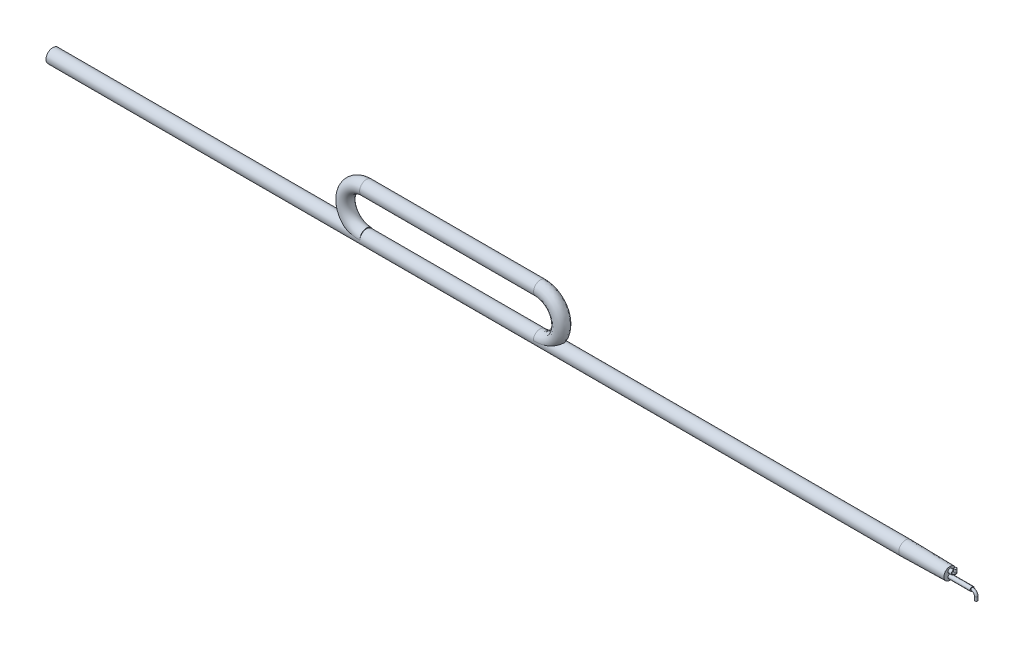
ISO-10303-21;
HEADER;
FILE_DESCRIPTION(('STEP AP214'),'2;1');
FILE_NAME('part.step','',(''),(''),'','','');
FILE_SCHEMA(('AUTOMOTIVE_DESIGN { 1 0 10303 214 1 1 1 1 }'));
ENDSEC;
DATA;
#1=APPLICATION_CONTEXT('core data for automotive mechanical design processes');
#2=APPLICATION_PROTOCOL_DEFINITION('international standard','automotive_design',2000,#1);
#3=PRODUCT_CONTEXT('',#1,'mechanical');
#4=PRODUCT('Part','Part','',(#3));
#5=PRODUCT_RELATED_PRODUCT_CATEGORY('part','',(#4));
#6=PRODUCT_DEFINITION_FORMATION('','',#4);
#7=PRODUCT_DEFINITION_CONTEXT('part definition',#1,'design');
#8=PRODUCT_DEFINITION('design','',#6,#7);
#9=PRODUCT_DEFINITION_SHAPE('','',#8);
#10=(LENGTH_UNIT() NAMED_UNIT(*) SI_UNIT(.MILLI.,.METRE.));
#11=(NAMED_UNIT(*) PLANE_ANGLE_UNIT() SI_UNIT($,.RADIAN.));
#12=(NAMED_UNIT(*) SI_UNIT($,.STERADIAN.) SOLID_ANGLE_UNIT());
#13=UNCERTAINTY_MEASURE_WITH_UNIT(LENGTH_MEASURE(1.E-05),#10,'distance_accuracy_value','');
#14=(GEOMETRIC_REPRESENTATION_CONTEXT(3) GLOBAL_UNCERTAINTY_ASSIGNED_CONTEXT((#13)) GLOBAL_UNIT_ASSIGNED_CONTEXT((#10,
#11,#12)) REPRESENTATION_CONTEXT('',''));
#15=CARTESIAN_POINT('',(0.,0.,0.));
#16=DIRECTION('',(0.,0.,1.));
#17=DIRECTION('',(1.,0.,0.));
#18=AXIS2_PLACEMENT_3D('',#15,#16,#17);
#19=CARTESIAN_POINT('',(178.691973889394,6.508026110606,0.));
#20=DIRECTION('',(0.,1.,0.));
#21=DIRECTION('',(0.,0.,1.));
#22=AXIS2_PLACEMENT_3D('',#19,#20,#21);
#23=CYLINDRICAL_SURFACE('',#22,0.374999999999992);
#24=CARTESIAN_POINT('',(178.691973889394,6.508026110606,0.));
#25=DIRECTION('',(0.,-1.,0.));
#26=DIRECTION('',(0.,0.,-1.));
#27=AXIS2_PLACEMENT_3D('',#24,#25,#26);
#28=CIRCLE('',#27,0.374999999999992);
#29=CARTESIAN_POINT('',(178.691973889394,6.508026110606,-0.375000000000006));
#30=VERTEX_POINT('',#29);
#31=EDGE_CURVE('E12',#30,#30,#28,.T.);
#32=ORIENTED_EDGE('',*,*,#31,.F.);
#33=EDGE_LOOP('',(#32));
#34=FACE_BOUND('',#33,.T.);
#35=CARTESIAN_POINT('',(178.691973889394,7.608026110606,0.));
#36=DIRECTION('',(0.,-1.,0.));
#37=DIRECTION('',(0.,0.,-1.));
#38=AXIS2_PLACEMENT_3D('',#35,#36,#37);
#39=CIRCLE('',#38,0.374999999999992);
#40=CARTESIAN_POINT('',(178.691973889394,7.608026110606,-0.375000000000006));
#41=VERTEX_POINT('',#40);
#42=EDGE_CURVE('E54',#41,#41,#39,.T.);
#43=ORIENTED_EDGE('',*,*,#42,.T.);
#44=EDGE_LOOP('',(#43));
#45=FACE_BOUND('',#44,.T.);
#46=ADVANCED_FACE('F51',(#34,#45),#23,.T.);
#47=CARTESIAN_POINT('',(178.691973889394,6.508026110606,0.));
#48=DIRECTION('',(0.,-1.,0.));
#49=DIRECTION('',(0.,0.,-1.));
#50=AXIS2_PLACEMENT_3D('',#47,#48,#49);
#51=PLANE('',#50);
#52=ORIENTED_EDGE('',*,*,#31,.T.);
#53=EDGE_LOOP('',(#52));
#54=FACE_BOUND('',#53,.T.);
#55=ADVANCED_FACE('F66',(#54),#51,.T.);
#56=CARTESIAN_POINT('',(178.691973889394,7.608026110606,0.));
#57=DIRECTION('',(0.,-1.,0.));
#58=DIRECTION('',(0.,0.,-1.));
#59=AXIS2_PLACEMENT_3D('',#56,#57,#58);
#60=PLANE('',#59);
#61=ORIENTED_EDGE('',*,*,#42,.F.);
#62=EDGE_LOOP('',(#61));
#63=FACE_BOUND('',#62,.T.);
#64=ADVANCED_FACE('F64',(#63),#60,.F.);
#65=CLOSED_SHELL('',(#46,#55,#64));
#66=MANIFOLD_SOLID_BREP('B2',#65);
#67=CARTESIAN_POINT('',(177.5,7.608026110606,0.));
#68=DIRECTION('',(0.,0.,1.));
#69=DIRECTION('',(1.,0.,0.));
#70=AXIS2_PLACEMENT_3D('',#67,#68,#69);
#71=TOROIDAL_SURFACE('',#70,1.19197388939396,0.374999999999992);
#72=CARTESIAN_POINT('',(178.691973889394,7.60802611060601,0.));
#73=DIRECTION('',(0.,-1.,0.));
#74=DIRECTION('',(0.,0.,-1.));
#75=AXIS2_PLACEMENT_3D('',#72,#73,#74);
#76=CIRCLE('',#75,0.374999999999992);
#77=CARTESIAN_POINT('',(179.066973889394,7.60802611060602,0.));
#78=VERTEX_POINT('',#77);
#79=EDGE_CURVE('E50',#78,#78,#76,.T.);
#80=CARTESIAN_POINT('',(177.5,8.8,0.));
#81=DIRECTION('',(1.,0.,0.));
#82=DIRECTION('',(0.,0.,-1.));
#83=AXIS2_PLACEMENT_3D('',#80,#81,#82);
#84=CIRCLE('',#83,0.374999999999992);
#85=CARTESIAN_POINT('',(177.5,9.17499999999995,0.));
#86=VERTEX_POINT('',#85);
#87=EDGE_CURVE('E105',#86,#86,#84,.T.);
#88=CARTESIAN_POINT('',(177.5,7.608026110606,0.));
#89=DIRECTION('',(0.,0.,1.));
#90=DIRECTION('',(1.,0.,0.));
#91=AXIS2_PLACEMENT_3D('',#88,#89,#90);
#92=CIRCLE('',#91,1.56697388939395);
#93=EDGE_CURVE('',#78,#86,#92,.T.);
#94=ORIENTED_EDGE('',*,*,#79,.F.);
#95=ORIENTED_EDGE('',*,*,#87,.T.);
#96=ORIENTED_EDGE('',*,*,#93,.T.);
#97=ORIENTED_EDGE('',*,*,#93,.F.);
#98=EDGE_LOOP('',(#94,#96,#95,#97));
#99=FACE_BOUND('',#98,.T.);
#100=ADVANCED_FACE('F99',(#99),#71,.T.);
#101=CARTESIAN_POINT('',(178.691973889394,7.60802611060601,0.));
#102=DIRECTION('',(0.,-1.,0.));
#103=DIRECTION('',(0.,0.,-1.));
#104=AXIS2_PLACEMENT_3D('',#101,#102,#103);
#105=PLANE('',#104);
#106=ORIENTED_EDGE('',*,*,#79,.T.);
#107=EDGE_LOOP('',(#106));
#108=FACE_BOUND('',#107,.T.);
#109=ADVANCED_FACE('F114',(#108),#105,.T.);
#110=CARTESIAN_POINT('',(177.5,8.8,0.));
#111=DIRECTION('',(1.,0.,0.));
#112=DIRECTION('',(0.,0.,-1.));
#113=AXIS2_PLACEMENT_3D('',#110,#111,#112);
#114=PLANE('',#113);
#115=ORIENTED_EDGE('',*,*,#87,.F.);
#116=EDGE_LOOP('',(#115));
#117=FACE_BOUND('',#116,.T.);
#118=ADVANCED_FACE('F112',(#117),#114,.F.);
#119=CLOSED_SHELL('',(#100,#109,#118));
#120=MANIFOLD_SOLID_BREP('B7',#119);
#121=CARTESIAN_POINT('',(172.6,11.6,0.));
#122=DIRECTION('',(0.,-1.,0.));
#123=DIRECTION('',(1.,0.,0.));
#124=AXIS2_PLACEMENT_3D('',#121,#122,#123);
#125=CYLINDRICAL_SURFACE('',#124,0.374999999999992);
#126=CARTESIAN_POINT('',(172.6,11.6,0.));
#127=DIRECTION('',(0.,1.,0.));
#128=DIRECTION('',(-1.,0.,0.));
#129=AXIS2_PLACEMENT_3D('',#126,#127,#128);
#130=CIRCLE('',#129,0.374999999999992);
#131=CARTESIAN_POINT('',(172.225,11.6,0.));
#132=VERTEX_POINT('',#131);
#133=EDGE_CURVE('E98',#132,#132,#130,.T.);
#134=ORIENTED_EDGE('',*,*,#133,.F.);
#135=EDGE_LOOP('',(#134));
#136=FACE_BOUND('',#135,.T.);
#137=CARTESIAN_POINT('',(172.6,10.8,0.));
#138=DIRECTION('',(0.,1.,0.));
#139=DIRECTION('',(-1.,0.,0.));
#140=AXIS2_PLACEMENT_3D('',#137,#138,#139);
#141=CIRCLE('',#140,0.374999999999992);
#142=CARTESIAN_POINT('',(172.225,10.8,0.));
#143=VERTEX_POINT('',#142);
#144=EDGE_CURVE('E150',#143,#143,#141,.T.);
#145=ORIENTED_EDGE('',*,*,#144,.T.);
#146=EDGE_LOOP('',(#145));
#147=FACE_BOUND('',#146,.T.);
#148=ADVANCED_FACE('F147',(#136,#147),#125,.T.);
#149=CARTESIAN_POINT('',(172.6,11.6,0.));
#150=DIRECTION('',(0.,1.,0.));
#151=DIRECTION('',(-1.,0.,0.));
#152=AXIS2_PLACEMENT_3D('',#149,#150,#151);
#153=PLANE('',#152);
#154=ORIENTED_EDGE('',*,*,#133,.T.);
#155=EDGE_LOOP('',(#154));
#156=FACE_BOUND('',#155,.T.);
#157=ADVANCED_FACE('F162',(#156),#153,.T.);
#158=CARTESIAN_POINT('',(172.6,10.8,0.));
#159=DIRECTION('',(0.,1.,0.));
#160=DIRECTION('',(-1.,0.,0.));
#161=AXIS2_PLACEMENT_3D('',#158,#159,#160);
#162=PLANE('',#161);
#163=ORIENTED_EDGE('',*,*,#144,.F.);
#164=EDGE_LOOP('',(#163));
#165=FACE_BOUND('',#164,.T.);
#166=ADVANCED_FACE('F160',(#165),#162,.F.);
#167=CLOSED_SHELL('',(#148,#157,#166));
#168=MANIFOLD_SOLID_BREP('B45',#167);
#169=CARTESIAN_POINT('',(172.,10.8,0.));
#170=DIRECTION('',(0.,0.,-1.));
#171=DIRECTION('',(-1.,0.,0.));
#172=AXIS2_PLACEMENT_3D('',#169,#170,#171);
#173=TOROIDAL_SURFACE('',#172,0.599999999999989,0.375);
#174=CARTESIAN_POINT('',(172.6,10.8,0.));
#175=DIRECTION('',(0.,1.,0.));
#176=DIRECTION('',(0.,0.,-1.));
#177=AXIS2_PLACEMENT_3D('',#174,#175,#176);
#178=CIRCLE('',#177,0.375);
#179=CARTESIAN_POINT('',(172.975,10.8,0.));
#180=VERTEX_POINT('',#179);
#181=EDGE_CURVE('E146',#180,#180,#178,.T.);
#182=CARTESIAN_POINT('',(172.,10.2,0.));
#183=DIRECTION('',(1.,0.,0.));
#184=DIRECTION('',(0.,0.,-1.));
#185=AXIS2_PLACEMENT_3D('',#182,#183,#184);
#186=CIRCLE('',#185,0.375);
#187=CARTESIAN_POINT('',(172.,9.82500000000001,0.));
#188=VERTEX_POINT('',#187);
#189=EDGE_CURVE('E201',#188,#188,#186,.T.);
#190=CARTESIAN_POINT('',(172.,10.8,0.));
#191=DIRECTION('',(0.,0.,-1.));
#192=DIRECTION('',(-1.,0.,0.));
#193=AXIS2_PLACEMENT_3D('',#190,#191,#192);
#194=CIRCLE('',#193,0.97499999999999);
#195=EDGE_CURVE('',#180,#188,#194,.T.);
#196=ORIENTED_EDGE('',*,*,#181,.F.);
#197=ORIENTED_EDGE('',*,*,#189,.T.);
#198=ORIENTED_EDGE('',*,*,#195,.T.);
#199=ORIENTED_EDGE('',*,*,#195,.F.);
#200=EDGE_LOOP('',(#196,#198,#197,#199));
#201=FACE_BOUND('',#200,.T.);
#202=ADVANCED_FACE('F195',(#201),#173,.T.);
#203=CARTESIAN_POINT('',(172.6,10.8,0.));
#204=DIRECTION('',(0.,1.,0.));
#205=DIRECTION('',(0.,0.,-1.));
#206=AXIS2_PLACEMENT_3D('',#203,#204,#205);
#207=PLANE('',#206);
#208=ORIENTED_EDGE('',*,*,#181,.T.);
#209=EDGE_LOOP('',(#208));
#210=FACE_BOUND('',#209,.T.);
#211=ADVANCED_FACE('F210',(#210),#207,.T.);
#212=CARTESIAN_POINT('',(172.,10.2,0.));
#213=DIRECTION('',(1.,0.,0.));
#214=DIRECTION('',(0.,0.,-1.));
#215=AXIS2_PLACEMENT_3D('',#212,#213,#214);
#216=PLANE('',#215);
#217=ORIENTED_EDGE('',*,*,#189,.F.);
#218=EDGE_LOOP('',(#217));
#219=FACE_BOUND('',#218,.T.);
#220=ADVANCED_FACE('F208',(#219),#216,.F.);
#221=CLOSED_SHELL('',(#202,#211,#220));
#222=MANIFOLD_SOLID_BREP('B93',#221);
#223=CARTESIAN_POINT('',(177.5,8.8,0.));
#224=DIRECTION('',(-1.,0.,0.));
#225=DIRECTION('',(0.,0.,1.));
#226=AXIS2_PLACEMENT_3D('',#223,#224,#225);
#227=CYLINDRICAL_SURFACE('',#226,0.6);
#228=CARTESIAN_POINT('',(177.5,8.8,0.));
#229=DIRECTION('',(1.,0.,0.));
#230=DIRECTION('',(0.,0.,-1.));
#231=AXIS2_PLACEMENT_3D('',#228,#229,#230);
#232=CIRCLE('',#231,0.6);
#233=CARTESIAN_POINT('',(177.5,8.8,-0.600000000000015));
#234=VERTEX_POINT('',#233);
#235=EDGE_CURVE('E194',#234,#234,#232,.T.);
#236=ORIENTED_EDGE('',*,*,#235,.F.);
#237=EDGE_LOOP('',(#236));
#238=FACE_BOUND('',#237,.T.);
#239=CARTESIAN_POINT('',(171.,8.8,0.));
#240=DIRECTION('',(1.,0.,0.));
#241=DIRECTION('',(0.,0.,-1.));
#242=AXIS2_PLACEMENT_3D('',#239,#240,#241);
#243=CIRCLE('',#242,0.6);
#244=CARTESIAN_POINT('',(171.,8.8,-0.600000000000015));
#245=VERTEX_POINT('',#244);
#246=EDGE_CURVE('E246',#245,#245,#243,.T.);
#247=ORIENTED_EDGE('',*,*,#246,.T.);
#248=EDGE_LOOP('',(#247));
#249=FACE_BOUND('',#248,.T.);
#250=ADVANCED_FACE('F243',(#238,#249),#227,.T.);
#251=CARTESIAN_POINT('',(177.5,0.,0.));
#252=DIRECTION('',(1.,0.,0.));
#253=DIRECTION('',(0.,0.,-1.));
#254=AXIS2_PLACEMENT_3D('',#251,#252,#253);
#255=PLANE('',#254);
#256=ORIENTED_EDGE('',*,*,#235,.T.);
#257=EDGE_LOOP('',(#256));
#258=FACE_BOUND('',#257,.T.);
#259=ADVANCED_FACE('F258',(#258),#255,.T.);
#260=CARTESIAN_POINT('',(171.,0.,0.));
#261=DIRECTION('',(1.,0.,0.));
#262=DIRECTION('',(0.,0.,-1.));
#263=AXIS2_PLACEMENT_3D('',#260,#261,#262);
#264=PLANE('',#263);
#265=ORIENTED_EDGE('',*,*,#246,.F.);
#266=EDGE_LOOP('',(#265));
#267=FACE_BOUND('',#266,.T.);
#268=ADVANCED_FACE('F256',(#267),#264,.F.);
#269=CLOSED_SHELL('',(#250,#259,#268));
#270=MANIFOLD_SOLID_BREP('B141',#269);
#271=CARTESIAN_POINT('',(172.,10.2,0.));
#272=DIRECTION('',(-1.,0.,0.));
#273=DIRECTION('',(0.,0.,1.));
#274=AXIS2_PLACEMENT_3D('',#271,#272,#273);
#275=CYLINDRICAL_SURFACE('',#274,0.6);
#276=CARTESIAN_POINT('',(172.,10.2,0.));
#277=DIRECTION('',(1.,0.,0.));
#278=DIRECTION('',(0.,0.,-1.));
#279=AXIS2_PLACEMENT_3D('',#276,#277,#278);
#280=CIRCLE('',#279,0.6);
#281=CARTESIAN_POINT('',(172.,10.2,-0.6));
#282=VERTEX_POINT('',#281);
#283=EDGE_CURVE('E242',#282,#282,#280,.T.);
#284=ORIENTED_EDGE('',*,*,#283,.F.);
#285=EDGE_LOOP('',(#284));
#286=FACE_BOUND('',#285,.T.);
#287=CARTESIAN_POINT('',(171.,10.2,0.));
#288=DIRECTION('',(1.,0.,0.));
#289=DIRECTION('',(0.,0.,-1.));
#290=AXIS2_PLACEMENT_3D('',#287,#288,#289);
#291=CIRCLE('',#290,0.6);
#292=CARTESIAN_POINT('',(171.,10.2,-0.6));
#293=VERTEX_POINT('',#292);
#294=EDGE_CURVE('E295',#293,#293,#291,.T.);
#295=ORIENTED_EDGE('',*,*,#294,.T.);
#296=EDGE_LOOP('',(#295));
#297=FACE_BOUND('',#296,.T.);
#298=ADVANCED_FACE('F292',(#286,#297),#275,.T.);
#299=CARTESIAN_POINT('',(172.,0.,0.));
#300=DIRECTION('',(1.,0.,0.));
#301=DIRECTION('',(0.,0.,-1.));
#302=AXIS2_PLACEMENT_3D('',#299,#300,#301);
#303=PLANE('',#302);
#304=ORIENTED_EDGE('',*,*,#283,.T.);
#305=EDGE_LOOP('',(#304));
#306=FACE_BOUND('',#305,.T.);
#307=ADVANCED_FACE('F307',(#306),#303,.T.);
#308=CARTESIAN_POINT('',(171.,0.,0.));
#309=DIRECTION('',(1.,0.,0.));
#310=DIRECTION('',(0.,0.,-1.));
#311=AXIS2_PLACEMENT_3D('',#308,#309,#310);
#312=PLANE('',#311);
#313=ORIENTED_EDGE('',*,*,#294,.F.);
#314=EDGE_LOOP('',(#313));
#315=FACE_BOUND('',#314,.T.);
#316=ADVANCED_FACE('F305',(#315),#312,.F.);
#317=CLOSED_SHELL('',(#298,#307,#316));
#318=MANIFOLD_SOLID_BREP('B189',#317);
#319=CARTESIAN_POINT('',(-0.0543412460551826,15.8356948487462,0.));
#320=DIRECTION('',(0.,0.,1.));
#321=DIRECTION('',(1.,0.,0.));
#322=AXIS2_PLACEMENT_3D('',#319,#320,#321);
#323=TOROIDAL_SURFACE('',#322,6.16430515125375,2.);
#324=CARTESIAN_POINT('',(-0.0543412460551826,22.,0.));
#325=DIRECTION('',(-1.,0.,0.));
#326=DIRECTION('',(0.,-1.,0.));
#327=AXIS2_PLACEMENT_3D('',#324,#325,#326);
#328=CIRCLE('',#327,2.);
#329=CARTESIAN_POINT('',(-0.0543412460551826,24.,0.));
#330=VERTEX_POINT('',#329);
#331=EDGE_CURVE('E367',#330,#330,#328,.T.);
#332=CARTESIAN_POINT('',(0.,9.67162922395356,0.));
#333=DIRECTION('',(0.999961142990945,0.00881546982537039,0.));
#334=DIRECTION('',(-0.00881546982537039,0.999961142990945,0.));
#335=AXIS2_PLACEMENT_3D('',#332,#333,#334);
#336=CIRCLE('',#335,2.);
#337=CARTESIAN_POINT('',(0.0176309396508251,7.67170693797167,0.));
#338=VERTEX_POINT('',#337);
#339=EDGE_CURVE('E344',#338,#338,#336,.T.);
#340=CARTESIAN_POINT('',(-0.0543412460551826,15.8356948487462,0.));
#341=DIRECTION('',(0.,0.,1.));
#342=DIRECTION('',(1.,0.,0.));
#343=AXIS2_PLACEMENT_3D('',#340,#341,#342);
#344=CIRCLE('',#343,8.16430515125375);
#345=EDGE_CURVE('',#330,#338,#344,.T.);
#346=ORIENTED_EDGE('',*,*,#331,.T.);
#347=ORIENTED_EDGE('',*,*,#339,.F.);
#348=ORIENTED_EDGE('',*,*,#345,.T.);
#349=ORIENTED_EDGE('',*,*,#345,.F.);
#350=EDGE_LOOP('',(#346,#348,#347,#349));
#351=FACE_BOUND('',#350,.T.);
#352=ADVANCED_FACE('F332',(#351),#323,.T.);
#353=CARTESIAN_POINT('',(50.8416306553474,9.5,0.));
#354=DIRECTION('',(-1.,0.,0.));
#355=DIRECTION('',(0.,0.,1.));
#356=AXIS2_PLACEMENT_3D('',#353,#354,#355);
#357=CYLINDRICAL_SURFACE('',#356,2.);
#358=CARTESIAN_POINT('',(50.8416306553474,9.5,0.));
#359=DIRECTION('',(1.,0.,0.));
#360=DIRECTION('',(0.,0.,-1.));
#361=AXIS2_PLACEMENT_3D('',#358,#359,#360);
#362=CIRCLE('',#361,2.);
#363=CARTESIAN_POINT('',(50.8416306553474,9.5,-2.));
#364=VERTEX_POINT('',#363);
#365=CARTESIAN_POINT('',(50.8416306553474,9.50000000000002,2.));
#366=VERTEX_POINT('',#365);
#367=EDGE_CURVE('E350',#364,#366,#362,.T.);
#368=ORIENTED_EDGE('',*,*,#367,.F.);
#369=CARTESIAN_POINT('',(50.8416306553474,9.50000000000002,2.));
#370=CARTESIAN_POINT('',(50.8626764706467,9.50000000825948,2.00000000044204));
#371=CARTESIAN_POINT('',(50.8837222018706,9.50005232330894,2.00000000400459));
#372=CARTESIAN_POINT('',(50.9225670794504,9.50024562533767,1.99999998523166));
#373=CARTESIAN_POINT('',(50.9403662997798,9.50037169092644,1.99999996680595));
#374=CARTESIAN_POINT('',(51.0293633300194,9.50118981686466,1.99999977457273));
#375=CARTESIAN_POINT('',(51.1005567566543,9.50244524563309,1.99999930044522));
#376=CARTESIAN_POINT('',(51.2596576140393,9.50660370301003,1.99999050452446));
#377=CARTESIAN_POINT('',(51.3475569010666,9.50982485628498,1.99998036276797));
#378=CARTESIAN_POINT('',(51.5123170054663,9.51760099906476,1.99992567178634));
#379=CARTESIAN_POINT('',(51.5891882702241,9.52193972557477,1.9998855681882));
#380=CARTESIAN_POINT('',(51.8196733885244,9.53709715617824,1.99968240453078));
#381=CARTESIAN_POINT('',(51.9731526237032,9.55005694174451,1.99943648830985));
#382=CARTESIAN_POINT('',(52.2797580394897,9.58163748155805,1.99839499525117));
#383=CARTESIAN_POINT('',(52.4328833055712,9.60026696938622,1.9975985679858));
#384=CARTESIAN_POINT('',(52.792979802228,9.65064632922907,1.99453176200638));
#385=CARTESIAN_POINT('',(52.9996286102012,9.68470576645007,1.99183620170313));
#386=CARTESIAN_POINT('',(53.4111470470982,9.76247905386712,1.98308841896656));
#387=CARTESIAN_POINT('',(53.6160156345483,9.80619820567159,1.9770343504925));
#388=CARTESIAN_POINT('',(54.0235493861958,9.90313346486231,1.95956933611199));
#389=CARTESIAN_POINT('',(54.2262115498279,9.95636111937909,1.94815184908209));
#390=CARTESIAN_POINT('',(54.6276898206661,10.0715470298678,1.91751819127014));
#391=CARTESIAN_POINT('',(54.8265168984989,10.1334741065359,1.89832942991925));
#392=CARTESIAN_POINT('',(55.2199793834508,10.2653492732942,1.84910877849888));
#393=CARTESIAN_POINT('',(55.4146191009504,10.3352885953125,1.81908866563015));
#394=CARTESIAN_POINT('',(55.7023260740726,10.4451286603418,1.7630667320775));
#395=CARTESIAN_POINT('',(55.7974372567096,10.4825285564388,1.74258378891787));
#396=CARTESIAN_POINT('',(55.9860418113794,10.5587726821453,1.69734197358713));
#397=CARTESIAN_POINT('',(56.0795355384639,10.597616588727,1.67258405327337));
#398=CARTESIAN_POINT('',(56.2490867888097,10.6698897625521,1.62263670263363));
#399=CARTESIAN_POINT('',(56.3254457857647,10.7031383536705,1.59821165248582));
#400=CARTESIAN_POINT('',(56.4765211620943,10.7702629753463,1.54539867099386));
#401=CARTESIAN_POINT('',(56.5512373629883,10.8041390733493,1.51701031149656));
#402=CARTESIAN_POINT('',(56.6985720175586,10.8722268806295,1.45570987041217));
#403=CARTESIAN_POINT('',(56.7711921434981,10.9064382914619,1.42280152280235));
#404=CARTESIAN_POINT('',(56.9138198693132,10.974839478128,1.35176842858207));
#405=CARTESIAN_POINT('',(56.9838280536692,11.0090292570986,1.31364485801348));
#406=CARTESIAN_POINT('',(57.1436788779067,11.0884032809882,1.21741160061834));
#407=CARTESIAN_POINT('',(57.232228797261,11.1333982286185,1.15690173299376));
#408=CARTESIAN_POINT('',(57.3582868373051,11.1986945912172,1.0564174876609));
#409=CARTESIAN_POINT('',(57.3991498021921,11.2200785708158,1.02133326651412));
#410=CARTESIAN_POINT('',(57.4781818930457,11.2618065824454,0.947543517000946));
#411=CARTESIAN_POINT('',(57.5163473095983,11.2821491722566,0.908833166000575));
#412=CARTESIAN_POINT('',(57.6009610455307,11.3276125248541,0.81448687706411));
#413=CARTESIAN_POINT('',(57.6461344847664,11.352170404173,0.757407111419154));
#414=CARTESIAN_POINT('',(57.7282610943462,11.3971941815307,0.636244675173851));
#415=CARTESIAN_POINT('',(57.7652362569914,11.4176710118779,0.572181444860619));
#416=CARTESIAN_POINT('',(57.8219404063203,11.4492584657883,0.451076837389617));
#417=CARTESIAN_POINT('',(57.8436465466671,11.4614265475225,0.395249066864587));
#418=CARTESIAN_POINT('',(57.8786863550242,11.4811269487139,0.280229983136105));
#419=CARTESIAN_POINT('',(57.892027364744,11.4886633330938,0.221041669238267));
#420=CARTESIAN_POINT('',(57.9092378431116,11.4983937410725,0.100479639440275));
#421=CARTESIAN_POINT('',(57.913051322256,11.5005561837638,0.0390951452268223));
#422=CARTESIAN_POINT('',(57.910653408215,11.4991982812538,-0.0834146617949375));
#423=CARTESIAN_POINT('',(57.904441886005,11.4956778629125,-0.144539971257313));
#424=CARTESIAN_POINT('',(57.883589274371,11.4839001415669,-0.259174235309216));
#425=CARTESIAN_POINT('',(57.8697404302607,11.4760882635322,-0.312879298710887));
#426=CARTESIAN_POINT('',(57.8351938835199,11.456689159205,-0.41736843483125));
#427=CARTESIAN_POINT('',(57.814487006424,11.4450968759231,-0.468148487152212));
#428=CARTESIAN_POINT('',(57.7733579997555,11.4222047839744,-0.553683331542066));
#429=CARTESIAN_POINT('',(57.7541921756028,11.4115745863159,-0.589239361453154));
#430=CARTESIAN_POINT('',(57.7131617492494,11.3889265161128,-0.6582346354972));
#431=CARTESIAN_POINT('',(57.6912994629251,11.3769098349244,-0.691675659282319));
#432=CARTESIAN_POINT('',(57.6221440418147,11.3391041873445,-0.789021296824943));
#433=CARTESIAN_POINT('',(57.5713562837223,11.3116010857623,-0.849801445246369));
#434=CARTESIAN_POINT('',(57.4734878607857,11.2592987471689,-0.952646915050242));
#435=CARTESIAN_POINT('',(57.4275347884543,11.2349778936479,-0.99607431069462));
#436=CARTESIAN_POINT('',(57.3322235372816,11.1851122206334,-1.07828911177227));
#437=CARTESIAN_POINT('',(57.2828634354355,11.1595667124429,-1.11707386246396));
#438=CARTESIAN_POINT('',(57.1814211248026,11.1077141730624,-1.19049533980674));
#439=CARTESIAN_POINT('',(57.1293348127674,11.0814060222023,-1.22512553957021));
#440=CARTESIAN_POINT('',(57.023024161077,11.0284124178366,-1.29063066244024));
#441=CARTESIAN_POINT('',(56.9687990267845,11.0017268265078,-1.32150417208516));
#442=CARTESIAN_POINT('',(56.807185608309,10.9232938306181,-1.40716590999183));
#443=CARTESIAN_POINT('',(56.6974272379926,10.8714080753411,-1.45737134965615));
#444=CARTESIAN_POINT('',(56.4733920551304,10.768579145099,-1.54770226943581));
#445=CARTESIAN_POINT('',(56.359110990787,10.7176369265186,-1.58781799049942));
#446=CARTESIAN_POINT('',(56.1270562283368,10.6174212696575,-1.65987399299164));
#447=CARTESIAN_POINT('',(56.0092766687591,10.5681509672112,-1.6917995770506));
#448=CARTESIAN_POINT('',(55.7712223994969,10.4719457756463,-1.74884066610327));
#449=CARTESIAN_POINT('',(55.6509485446395,10.4250101045653,-1.77395846401171));
#450=CARTESIAN_POINT('',(55.3806967043237,10.3234773664128,-1.82366942374262));
#451=CARTESIAN_POINT('',(55.2301980078758,10.2695731397307,-1.8468374761571));
#452=CARTESIAN_POINT('',(54.926709638197,10.1665034627175,-1.88648329638169));
#453=CARTESIAN_POINT('',(54.7737194610512,10.1173389852963,-1.90295969284223));
#454=CARTESIAN_POINT('',(54.4659215303094,10.0242350595108,-1.93068201004688));
#455=CARTESIAN_POINT('',(54.3111164320499,9.98028882371439,-1.94193478193816));
#456=CARTESIAN_POINT('',(53.999861165936,9.89783248372284,-1.96048792324858));
#457=CARTESIAN_POINT('',(53.8434112067594,9.85932169868374,-1.96778878800859));
#458=CARTESIAN_POINT('',(53.499361953684,9.78116258796567,-1.98060687317723));
#459=CARTESIAN_POINT('',(53.3114754450619,9.74268039966061,-1.98552433326028));
#460=CARTESIAN_POINT('',(52.9342072709816,9.67384070386085,-1.99273033070913));
#461=CARTESIAN_POINT('',(52.7448258953925,9.64348165920939,-1.99501936572666));
#462=CARTESIAN_POINT('',(52.4376964245297,9.60126322491367,-1.99749917299219));
#463=CARTESIAN_POINT('',(52.3203081730226,9.58677279205581,-1.99815787499022));
#464=CARTESIAN_POINT('',(52.0851754096679,9.56110455835054,-1.99910772653875));
#465=CARTESIAN_POINT('',(51.9674309216676,9.54992654051133,-1.99939890016962));
#466=CARTESIAN_POINT('',(51.7054465268372,9.52881183141979,-1.9998267103151));
#467=CARTESIAN_POINT('',(51.5611385360449,9.51970425111304,-1.99991456870707));
#468=CARTESIAN_POINT('',(51.3313506236012,9.50920093713299,-1.99998220464631));
#469=CARTESIAN_POINT('',(51.2459411621392,9.50617462265504,-1.99999148480671));
#470=CARTESIAN_POINT('',(51.0752777828055,9.50186496976897,-2.00000043546053));
#471=CARTESIAN_POINT('',(50.9900239727725,9.50057754020889,-2.00000012855111));
#472=CARTESIAN_POINT('',(50.8837220504974,9.50005325265812,-1.99999996057861));
#473=CARTESIAN_POINT('',(50.8626762760405,9.50000228183407,-1.99999993781608));
#474=CARTESIAN_POINT('',(50.8416306553474,9.50000416985201,-1.99999999999131));
#475=B_SPLINE_CURVE_WITH_KNOTS('',3,(#369,#370,#371,#372,#373,#374,#375,#376,#377,#378,#379,
#380,#381,#382,#383,#384,#385,#386,#387,#388,#389,#390,#391,#392,#393,#394,#395,#396,#397,#398,
#399,#400,#401,#402,#403,#404,#405,#406,#407,#408,#409,#410,#411,#412,#413,#414,#415,#416,#417,
#418,#419,#420,#421,#422,#423,#424,#425,#426,#427,#428,#429,#430,#431,#432,#433,#434,#435,#436,
#437,#438,#439,#440,#441,#442,#443,#444,#445,#446,#447,#448,#449,#450,#451,#452,#453,#454,#455,
#456,#457,#458,#459,#460,#461,#462,#463,#464,#465,#466,#467,#468,#469,#470,#471,#472,#473,#474),
.UNSPECIFIED.,.F.,.F.,(4,2,2,2,2,2,2,2,2,2,2,2,2,2,2,2,2,2,2,2,2,2,2,2,2,2,2,2,2,2,2,2,2,2,2,2,
2,2,2,2,2,2,2,2,2,2,2,2,2,2,2,2,4),(0.,0.063137213237827,0.116536107649483,0.330138854318403,
0.59399274841673,0.824963274915193,1.28692215144951,1.74959626006813,2.37769289974915,
3.00613512217645,3.63534577858033,4.26235626025983,4.88868702217587,5.2012990553369,
5.51384157251114,5.77412327641359,6.03443312012977,6.29452920011021,6.55456672435948,
6.90248512072645,7.07617973476074,7.25010872867163,7.47988060860558,7.70902844886771,
7.89167060944509,8.07415224778268,8.25770376201394,8.44125763862342,8.60861365091261,
8.77619445738673,8.90132933957554,9.02635748750486,9.27691669949512,9.47989373818579,
9.68298629362402,9.8863938456962,10.0898776951293,10.4833337181165,10.8771688515772,
11.2717058630567,11.6661098258385,12.1504302783844,12.6348499347635,13.1186324333285,
13.6023542794647,14.1776971727166,14.7529311156985,15.1077312535664,15.4625081438208,
15.8961962917297,16.1525707868234,16.4083410413563,16.4714782443594),.UNSPECIFIED.);
#476=EDGE_CURVE('E290',#364,#366,#475,.F.);
#477=ORIENTED_EDGE('',*,*,#476,.T.);
#478=EDGE_LOOP('',(#368,#477));
#479=FACE_BOUND('',#478,.T.);
#480=CARTESIAN_POINT('',(158.,9.5,0.));
#481=DIRECTION('',(1.,0.,0.));
#482=DIRECTION('',(0.,0.,-1.));
#483=AXIS2_PLACEMENT_3D('',#480,#481,#482);
#484=CIRCLE('',#483,2.);
#485=CARTESIAN_POINT('',(158.,9.5,-2.));
#486=VERTEX_POINT('',#485);
#487=EDGE_CURVE('E363',#486,#486,#484,.T.);
#488=ORIENTED_EDGE('',*,*,#487,.F.);
#489=EDGE_LOOP('',(#488));
#490=FACE_BOUND('',#489,.T.);
#491=CARTESIAN_POINT('',(-92.,9.5,0.));
#492=DIRECTION('',(1.,0.,0.));
#493=DIRECTION('',(0.,0.,-1.));
#494=AXIS2_PLACEMENT_3D('',#491,#492,#493);
#495=CIRCLE('',#494,2.);
#496=CARTESIAN_POINT('',(-92.,9.5,-2.));
#497=VERTEX_POINT('',#496);
#498=EDGE_CURVE('E354',#497,#497,#495,.T.);
#499=ORIENTED_EDGE('',*,*,#498,.T.);
#500=EDGE_LOOP('',(#499));
#501=FACE_BOUND('',#500,.T.);
#502=ADVANCED_FACE('F356',(#479,#490,#501),#357,.T.);
#503=CARTESIAN_POINT('',(-92.,9.5,0.));
#504=DIRECTION('',(1.,0.,0.));
#505=DIRECTION('',(0.,0.,-1.));
#506=AXIS2_PLACEMENT_3D('',#503,#504,#505);
#507=PLANE('',#506);
#508=ORIENTED_EDGE('',*,*,#498,.F.);
#509=EDGE_LOOP('',(#508));
#510=FACE_BOUND('',#509,.T.);
#511=ADVANCED_FACE('F359',(#510),#507,.F.);
#512=CARTESIAN_POINT('',(50.8416306553474,9.5,-2.));
#513=CARTESIAN_POINT('',(51.1188721951863,9.5,-2.));
#514=CARTESIAN_POINT('',(51.7097730245175,9.53865467611853,-2.));
#515=CARTESIAN_POINT('',(52.6355251945935,9.73532777780691,-2.));
#516=CARTESIAN_POINT('',(53.6280606252787,10.1178091101531,-2.));
#517=CARTESIAN_POINT('',(54.5653196534166,10.6888826143969,-2.));
#518=CARTESIAN_POINT('',(55.3954658302602,11.4267308545007,-2.));
#519=CARTESIAN_POINT('',(56.0882700227403,12.2901366928491,-2.));
#520=CARTESIAN_POINT('',(56.6399935790979,13.3188473434443,-2.));
#521=CARTESIAN_POINT('',(56.9975821877915,14.4752279991262,-2.));
#522=CARTESIAN_POINT('',(57.1345655138929,15.7016278982299,-2.));
#523=CARTESIAN_POINT('',(57.0165976778548,16.9300027326156,-2.));
#524=CARTESIAN_POINT('',(56.6769663131797,18.0917842828548,-2.));
#525=CARTESIAN_POINT('',(56.1412454713812,19.1289186341761,-2.));
#526=CARTESIAN_POINT('',(55.46190005871,20.0029535937273,-2.));
#527=CARTESIAN_POINT('',(54.6432840683709,20.753573684508,-2.));
#528=CARTESIAN_POINT('',(53.7149843374241,21.3390984253175,-2.));
#529=CARTESIAN_POINT('',(52.7284936177647,21.7369099206404,-2.));
#530=CARTESIAN_POINT('',(51.8058977115259,21.9479011524593,-2.));
#531=CARTESIAN_POINT('',(51.2156680236016,21.9957050499816,-2.));
#532=CARTESIAN_POINT('',(50.9384597538539,22.,-2.));
#533=CARTESIAN_POINT('',(50.8416306553474,13.5,-2.));
#534=CARTESIAN_POINT('',(51.1188721951863,13.5,-2.));
#535=CARTESIAN_POINT('',(51.0618656659194,13.5135336263562,-2.));
#536=CARTESIAN_POINT('',(51.5170201492858,13.5848725090541,-2.));
#537=CARTESIAN_POINT('',(51.8358041314617,13.7222883848296,-2.));
#538=CARTESIAN_POINT('',(52.1858036134039,13.9293564535332,-2.));
#539=CARTESIAN_POINT('',(52.4759846049959,14.1892139470503,-2.));
#540=CARTESIAN_POINT('',(52.7375131901881,14.5161852917189,-2.));
#541=CARTESIAN_POINT('',(52.9196852985589,14.8540300409676,-2.));
#542=CARTESIAN_POINT('',(53.0601730051299,15.3050766317118,-2.));
#543=CARTESIAN_POINT('',(53.1062907935105,15.7328322402826,-2.));
#544=CARTESIAN_POINT('',(53.0668075543022,16.1612509109997,-2.));
#545=CARTESIAN_POINT('',(52.9333128252148,16.6144199511215,-2.));
#546=CARTESIAN_POINT('',(52.7564371479515,16.9550456854493,-2.));
#547=CARTESIAN_POINT('',(52.4998648135256,17.2860314984472,-2.));
#548=CARTESIAN_POINT('',(52.2142533638304,17.5503453244704,-2.));
#549=CARTESIAN_POINT('',(51.8654462662185,17.7628425198534,-2.));
#550=CARTESIAN_POINT('',(51.5556905881966,17.9050741070932,-2.));
#551=CARTESIAN_POINT('',(51.0802571106032,17.9837877953598,-2.));
#552=CARTESIAN_POINT('',(51.1846827120796,17.9957050499816,-2.));
#553=CARTESIAN_POINT('',(50.9074744423318,18.,-2.));
#554=CARTESIAN_POINT('',(50.8416306553474,13.5,2.));
#555=CARTESIAN_POINT('',(51.1188721951863,13.5,2.));
#556=CARTESIAN_POINT('',(51.0618656659194,13.5135336263562,2.));
#557=CARTESIAN_POINT('',(51.5170201492858,13.5848725090541,2.));
#558=CARTESIAN_POINT('',(51.8358041314617,13.7222883848296,2.));
#559=CARTESIAN_POINT('',(52.1858036134039,13.9293564535332,2.));
#560=CARTESIAN_POINT('',(52.4759846049959,14.1892139470503,2.));
#561=CARTESIAN_POINT('',(52.7375131901881,14.5161852917189,2.));
#562=CARTESIAN_POINT('',(52.9196852985589,14.8540300409676,2.));
#563=CARTESIAN_POINT('',(53.0601730051299,15.3050766317118,2.));
#564=CARTESIAN_POINT('',(53.1062907935105,15.7328322402826,2.));
#565=CARTESIAN_POINT('',(53.0668075543022,16.1612509109997,2.));
#566=CARTESIAN_POINT('',(52.9333128252148,16.6144199511215,2.));
#567=CARTESIAN_POINT('',(52.7564371479515,16.9550456854493,2.));
#568=CARTESIAN_POINT('',(52.4998648135256,17.2860314984472,2.));
#569=CARTESIAN_POINT('',(52.2142533638304,17.5503453244704,2.));
#570=CARTESIAN_POINT('',(51.8654462662185,17.7628425198534,2.));
#571=CARTESIAN_POINT('',(51.5556905881966,17.9050741070932,2.));
#572=CARTESIAN_POINT('',(51.0802571106032,17.9837877953598,2.));
#573=CARTESIAN_POINT('',(51.1846827120796,17.9957050499816,2.));
#574=CARTESIAN_POINT('',(50.9074744423318,18.,2.));
#575=CARTESIAN_POINT('',(50.8416306553474,9.5,2.));
#576=CARTESIAN_POINT('',(51.1188721951863,9.5,2.));
#577=CARTESIAN_POINT('',(51.7097730245175,9.53865467611853,2.));
#578=CARTESIAN_POINT('',(52.6355251945935,9.73532777780691,2.));
#579=CARTESIAN_POINT('',(53.6280606252787,10.1178091101531,2.));
#580=CARTESIAN_POINT('',(54.5653196534166,10.6888826143969,2.));
#581=CARTESIAN_POINT('',(55.3954658302602,11.4267308545007,2.));
#582=CARTESIAN_POINT('',(56.0882700227403,12.2901366928491,2.));
#583=CARTESIAN_POINT('',(56.6399935790979,13.3188473434443,2.));
#584=CARTESIAN_POINT('',(56.9975821877915,14.4752279991262,2.));
#585=CARTESIAN_POINT('',(57.1345655138929,15.7016278982299,2.));
#586=CARTESIAN_POINT('',(57.0165976778548,16.9300027326156,2.));
#587=CARTESIAN_POINT('',(56.6769663131797,18.0917842828548,2.));
#588=CARTESIAN_POINT('',(56.1412454713812,19.1289186341761,2.));
#589=CARTESIAN_POINT('',(55.46190005871,20.0029535937273,2.));
#590=CARTESIAN_POINT('',(54.6432840683709,20.753573684508,2.));
#591=CARTESIAN_POINT('',(53.7149843374241,21.3390984253175,2.));
#592=CARTESIAN_POINT('',(52.7284936177647,21.7369099206404,2.));
#593=CARTESIAN_POINT('',(51.8058977115259,21.9479011524593,2.));
#594=CARTESIAN_POINT('',(51.2156680236016,21.9957050499816,2.));
#595=CARTESIAN_POINT('',(50.9384597538539,22.,2.));
#596=CARTESIAN_POINT('',(50.8416306553474,5.5,2.));
#597=CARTESIAN_POINT('',(51.1188721951863,5.5,2.));
#598=CARTESIAN_POINT('',(52.3576803831156,5.56377572588087,2.));
#599=CARTESIAN_POINT('',(53.7540302399011,5.88578304655971,2.));
#600=CARTESIAN_POINT('',(55.4203171190957,6.51332983547662,2.));
#601=CARTESIAN_POINT('',(56.9448356934292,7.44840877526054,2.));
#602=CARTESIAN_POINT('',(58.3149470555245,8.66424776195117,2.));
#603=CARTESIAN_POINT('',(59.4390268552926,10.0640880939794,2.));
#604=CARTESIAN_POINT('',(60.3603018596369,11.7836646459211,2.));
#605=CARTESIAN_POINT('',(60.9349913704531,13.6453793665406,2.));
#606=CARTESIAN_POINT('',(61.1628402342752,15.6704235561771,2.));
#607=CARTESIAN_POINT('',(60.9663878014073,17.6987545542316,2.));
#608=CARTESIAN_POINT('',(60.4206198011446,19.5691486145882,2.));
#609=CARTESIAN_POINT('',(59.5260537948109,21.3027915829029,2.));
#610=CARTESIAN_POINT('',(58.4239353038946,22.7198756890074,2.));
#611=CARTESIAN_POINT('',(57.0723147729115,23.9568020445457,2.));
#612=CARTESIAN_POINT('',(55.5645224086296,24.9153543307815,2.));
#613=CARTESIAN_POINT('',(53.9012966473329,25.5687457341876,2.));
#614=CARTESIAN_POINT('',(52.5315383124485,25.9120145095588,2.));
#615=CARTESIAN_POINT('',(51.2466533351237,25.9957050499816,2.));
#616=CARTESIAN_POINT('',(50.9694450653759,26.,2.));
#617=CARTESIAN_POINT('',(50.8416306553474,5.5,-2.));
#618=CARTESIAN_POINT('',(51.1188721951863,5.5,-2.));
#619=CARTESIAN_POINT('',(52.3576803831156,5.56377572588087,-2.));
#620=CARTESIAN_POINT('',(53.7540302399011,5.88578304655971,-2.));
#621=CARTESIAN_POINT('',(55.4203171190957,6.51332983547662,-2.));
#622=CARTESIAN_POINT('',(56.9448356934292,7.44840877526054,-2.));
#623=CARTESIAN_POINT('',(58.3149470555245,8.66424776195117,-2.));
#624=CARTESIAN_POINT('',(59.4390268552926,10.0640880939794,-2.));
#625=CARTESIAN_POINT('',(60.3603018596369,11.7836646459211,-2.));
#626=CARTESIAN_POINT('',(60.9349913704531,13.6453793665406,-2.));
#627=CARTESIAN_POINT('',(61.1628402342752,15.6704235561771,-2.));
#628=CARTESIAN_POINT('',(60.9663878014073,17.6987545542316,-2.));
#629=CARTESIAN_POINT('',(60.4206198011446,19.5691486145882,-2.));
#630=CARTESIAN_POINT('',(59.5260537948109,21.3027915829029,-2.));
#631=CARTESIAN_POINT('',(58.4239353038946,22.7198756890074,-2.));
#632=CARTESIAN_POINT('',(57.0723147729115,23.9568020445457,-2.));
#633=CARTESIAN_POINT('',(55.5645224086296,24.9153543307815,-2.));
#634=CARTESIAN_POINT('',(53.9012966473329,25.5687457341876,-2.));
#635=CARTESIAN_POINT('',(52.5315383124485,25.9120145095588,-2.));
#636=CARTESIAN_POINT('',(51.2466533351237,25.9957050499816,-2.));
#637=CARTESIAN_POINT('',(50.9694450653759,26.,-2.));
#638=CARTESIAN_POINT('',(50.8416306553474,9.5,-2.));
#639=CARTESIAN_POINT('',(51.1188721951863,9.5,-2.));
#640=CARTESIAN_POINT('',(51.7097730245175,9.53865467611853,-2.));
#641=CARTESIAN_POINT('',(52.6355251945935,9.73532777780691,-2.));
#642=CARTESIAN_POINT('',(53.6280606252787,10.1178091101531,-2.));
#643=CARTESIAN_POINT('',(54.5653196534166,10.6888826143969,-2.));
#644=CARTESIAN_POINT('',(55.3954658302602,11.4267308545007,-2.));
#645=CARTESIAN_POINT('',(56.0882700227403,12.2901366928491,-2.));
#646=CARTESIAN_POINT('',(56.6399935790979,13.3188473434443,-2.));
#647=CARTESIAN_POINT('',(56.9975821877915,14.4752279991262,-2.));
#648=CARTESIAN_POINT('',(57.1345655138929,15.7016278982299,-2.));
#649=CARTESIAN_POINT('',(57.0165976778548,16.9300027326156,-2.));
#650=CARTESIAN_POINT('',(56.6769663131797,18.0917842828548,-2.));
#651=CARTESIAN_POINT('',(56.1412454713812,19.1289186341761,-2.));
#652=CARTESIAN_POINT('',(55.46190005871,20.0029535937273,-2.));
#653=CARTESIAN_POINT('',(54.6432840683709,20.753573684508,-2.));
#654=CARTESIAN_POINT('',(53.7149843374241,21.3390984253175,-2.));
#655=CARTESIAN_POINT('',(52.7284936177647,21.7369099206404,-2.));
#656=CARTESIAN_POINT('',(51.8058977115259,21.9479011524593,-2.));
#657=CARTESIAN_POINT('',(51.2156680236016,21.9957050499816,-2.));
#658=CARTESIAN_POINT('',(50.9384597538539,22.,-2.));
#659=(BOUNDED_SURFACE() B_SPLINE_SURFACE(3,3,((#512,#513,#514,#515,#516,#517,#518,#519,#520,
#521,#522,#523,#524,#525,#526,#527,#528,#529,#530,#531,#532),(#533,#534,#535,#536,#537,#538,
#539,#540,#541,#542,#543,#544,#545,#546,#547,#548,#549,#550,#551,#552,#553),(#554,#555,#556,
#557,#558,#559,#560,#561,#562,#563,#564,#565,#566,#567,#568,#569,#570,#571,#572,#573,#574),
(#575,#576,#577,#578,#579,#580,#581,#582,#583,#584,#585,#586,#587,#588,#589,#590,#591,#592,#593,
#594,#595),(#596,#597,#598,#599,#600,#601,#602,#603,#604,#605,#606,#607,#608,#609,#610,#611,
#612,#613,#614,#615,#616),(#617,#618,#619,#620,#621,#622,#623,#624,#625,#626,#627,#628,#629,
#630,#631,#632,#633,#634,#635,#636,#637),(#638,#639,#640,#641,#642,#643,#644,#645,#646,#647,
#648,#649,#650,#651,#652,#653,#654,#655,#656,#657,#658)),.UNSPECIFIED.,.T.,.F.,
.F.) B_SPLINE_SURFACE_WITH_KNOTS((4,3,4),(4,1,1,1,1,1,1,1,1,1,1,1,1,1,1,1,1,1,4),(0.,0.5,1.),
(0.,0.0426260375283533,0.0907327044166282,0.144975277982239,0.205405545680428,0.258416618388931,
0.314998878878476,0.374732269100834,0.436799523032778,0.499999946769323,0.563200370505867,
0.625267624437811,0.685001014660171,0.741583275149715,0.79459434785822,0.85502461555641,
0.90926718912202,0.957373856010296,1.),
.UNSPECIFIED.) GEOMETRIC_REPRESENTATION_ITEM() RATIONAL_B_SPLINE_SURFACE(((1.,1.,1.,1.,1.,1.,1.,
1.,1.,1.,1.,1.,1.,1.,1.,1.,1.,1.,1.,1.,1.),(0.333333333333333,0.333333333333333,
0.333333333333333,0.333333333333333,0.333333333333333,0.333333333333333,0.333333333333333,
0.333333333333333,0.333333333333333,0.333333333333333,0.333333333333333,0.333333333333333,
0.333333333333333,0.333333333333333,0.333333333333333,0.333333333333333,0.333333333333333,
0.333333333333333,0.333333333333333,0.333333333333333,0.333333333333333),(0.333333333333333,
0.333333333333333,0.333333333333333,0.333333333333333,0.333333333333333,0.333333333333333,
0.333333333333333,0.333333333333333,0.333333333333333,0.333333333333333,0.333333333333333,
0.333333333333333,0.333333333333333,0.333333333333333,0.333333333333333,0.333333333333333,
0.333333333333333,0.333333333333333,0.333333333333333,0.333333333333333,0.333333333333333),(1.,
1.,1.,1.,1.,1.,1.,1.,1.,1.,1.,1.,1.,1.,1.,1.,1.,1.,1.,1.,1.),(0.333333333333333,
0.333333333333333,0.333333333333333,0.333333333333333,0.333333333333333,0.333333333333333,
0.333333333333333,0.333333333333333,0.333333333333333,0.333333333333333,0.333333333333333,
0.333333333333333,0.333333333333333,0.333333333333333,0.333333333333333,0.333333333333333,
0.333333333333333,0.333333333333333,0.333333333333333,0.333333333333333,0.333333333333333),
(0.333333333333333,0.333333333333333,0.333333333333333,0.333333333333333,0.333333333333333,
0.333333333333333,0.333333333333333,0.333333333333333,0.333333333333333,0.333333333333333,
0.333333333333333,0.333333333333333,0.333333333333333,0.333333333333333,0.333333333333333,
0.333333333333333,0.333333333333333,0.333333333333333,0.333333333333333,0.333333333333333,
0.333333333333333),(1.,1.,1.,1.,1.,1.,1.,1.,1.,1.,1.,1.,1.,1.,1.,1.,1.,1.,1.,1.,1.))) REPRESENTATION_ITEM('') SURFACE());
#660=CARTESIAN_POINT('',(50.9384597538539,22.,-2.));
#661=CARTESIAN_POINT('',(50.9694450653759,26.,-2.));
#662=CARTESIAN_POINT('',(50.9694450653759,26.,2.));
#663=CARTESIAN_POINT('',(50.9384597538539,22.,2.));
#664=CARTESIAN_POINT('',(50.9074744423318,18.,2.));
#665=CARTESIAN_POINT('',(50.9074744423318,18.,-2.));
#666=CARTESIAN_POINT('',(50.9384597538539,22.,-2.));
#667=(BOUNDED_CURVE() B_SPLINE_CURVE(3,(#660,#661,#662,#663,#664,#665,#666),.UNSPECIFIED.,.T.,
.F.) B_SPLINE_CURVE_WITH_KNOTS((4,3,4),(0.,0.5,1.),
.UNSPECIFIED.) CURVE() GEOMETRIC_REPRESENTATION_ITEM() RATIONAL_B_SPLINE_CURVE((1.,
0.333333333333333,0.333333333333333,1.,0.333333333333333,0.333333333333333,1.)) REPRESENTATION_ITEM(''));
#668=CARTESIAN_POINT('',(50.9384597538539,22.,-2.));
#669=VERTEX_POINT('',#668);
#670=EDGE_CURVE('E370',#669,#669,#667,.T.);
#671=ORIENTED_EDGE('',*,*,#476,.F.);
#672=ORIENTED_EDGE('',*,*,#367,.T.);
#673=EDGE_LOOP('',(#671,#672));
#674=FACE_BOUND('',#673,.T.);
#675=ORIENTED_EDGE('',*,*,#670,.T.);
#676=EDGE_LOOP('',(#675));
#677=FACE_BOUND('',#676,.T.);
#678=ADVANCED_FACE('F351',(#674,#677),#659,.T.);
#679=CARTESIAN_POINT('',(0.,9.67162922395356,2.));
#680=DIRECTION('',(0.999961142990945,0.00881546982537039,0.));
#681=DIRECTION('',(-0.00881546982537039,0.999961142990945,0.));
#682=AXIS2_PLACEMENT_3D('',#679,#680,#681);
#683=PLANE('',#682);
#684=ORIENTED_EDGE('',*,*,#339,.T.);
#685=EDGE_LOOP('',(#684));
#686=FACE_BOUND('',#685,.T.);
#687=ADVANCED_FACE('F375',(#686),#683,.T.);
#688=CARTESIAN_POINT('',(50.9384597538539,22.,-2.));
#689=CARTESIAN_POINT('',(-0.0543412460551826,22.,-2.));
#690=CARTESIAN_POINT('',(50.9694450653759,26.,-2.));
#691=CARTESIAN_POINT('',(-0.0543412460551756,26.,-2.));
#692=CARTESIAN_POINT('',(50.9694450653759,26.,2.));
#693=CARTESIAN_POINT('',(-0.0543412460551756,26.,2.));
#694=CARTESIAN_POINT('',(50.9384597538539,22.,2.));
#695=CARTESIAN_POINT('',(-0.0543412460551826,22.,2.));
#696=CARTESIAN_POINT('',(50.9074744423318,18.,2.));
#697=CARTESIAN_POINT('',(-0.0543412460551756,18.,2.));
#698=CARTESIAN_POINT('',(50.9074744423318,18.,-2.));
#699=CARTESIAN_POINT('',(-0.0543412460551756,18.,-2.));
#700=CARTESIAN_POINT('',(50.9384597538539,22.,-2.));
#701=CARTESIAN_POINT('',(-0.0543412460551826,22.,-2.));
#702=(BOUNDED_SURFACE() B_SPLINE_SURFACE(3,1,((#688,#689),(#690,#691),(#692,#693),(#694,#695),
(#696,#697),(#698,#699),(#700,#701)),.UNSPECIFIED.,.T.,.F.,.F.) B_SPLINE_SURFACE_WITH_KNOTS((4,
3,4),(2,2),(0.,0.5,1.),(0.,1.),
.UNSPECIFIED.) GEOMETRIC_REPRESENTATION_ITEM() RATIONAL_B_SPLINE_SURFACE(((1.,1.),
(0.333333333333333,0.333333333333333),(0.333333333333333,0.333333333333333),(1.,1.),
(0.333333333333333,0.333333333333333),(0.333333333333333,0.333333333333333),(1.,1.))) REPRESENTATION_ITEM('') SURFACE());
#703=ORIENTED_EDGE('',*,*,#670,.F.);
#704=EDGE_LOOP('',(#703));
#705=FACE_BOUND('',#704,.T.);
#706=ORIENTED_EDGE('',*,*,#331,.F.);
#707=EDGE_LOOP('',(#706));
#708=FACE_BOUND('',#707,.T.);
#709=ADVANCED_FACE('F383',(#705,#708),#702,.F.);
#710=CARTESIAN_POINT('',(158.,9.5,0.));
#711=DIRECTION('',(-1.,0.,0.));
#712=DIRECTION('',(0.,0.,-1.));
#713=AXIS2_PLACEMENT_3D('',#710,#711,#712);
#714=CONICAL_SURFACE('',#713,2.,0.0174532925199433);
#715=CARTESIAN_POINT('',(171.,9.5,0.));
#716=DIRECTION('',(1.,0.,0.));
#717=DIRECTION('',(0.,0.,-1.));
#718=AXIS2_PLACEMENT_3D('',#715,#716,#717);
#719=CIRCLE('',#718,1.77308415593317);
#720=CARTESIAN_POINT('',(171.,9.5,-1.77308415593317));
#721=VERTEX_POINT('',#720);
#722=EDGE_CURVE('E475',#721,#721,#719,.T.);
#723=ORIENTED_EDGE('',*,*,#722,.F.);
#724=EDGE_LOOP('',(#723));
#725=FACE_BOUND('',#724,.T.);
#726=ORIENTED_EDGE('',*,*,#487,.T.);
#727=EDGE_LOOP('',(#726));
#728=FACE_BOUND('',#727,.T.);
#729=ADVANCED_FACE('F385',(#725,#728),#714,.T.);
#730=CARTESIAN_POINT('',(171.,9.5,0.));
#731=DIRECTION('',(1.,0.,0.));
#732=DIRECTION('',(0.,0.,-1.));
#733=AXIS2_PLACEMENT_3D('',#730,#731,#732);
#734=PLANE('',#733);
#735=ORIENTED_EDGE('',*,*,#722,.T.);
#736=EDGE_LOOP('',(#735));
#737=FACE_BOUND('',#736,.T.);
#738=ADVANCED_FACE('F392',(#737),#734,.T.);
#739=CLOSED_SHELL('',(#352,#502,#511,#678,#687,#709,#729,#738));
#740=MANIFOLD_SOLID_BREP('B237',#739);
#741=ADVANCED_BREP_SHAPE_REPRESENTATION('',(#18,#66,#120,#168,#222,#270,#318,#740),#14);
#742=SHAPE_DEFINITION_REPRESENTATION(#9,#741);
ENDSEC;
END-ISO-10303-21;
